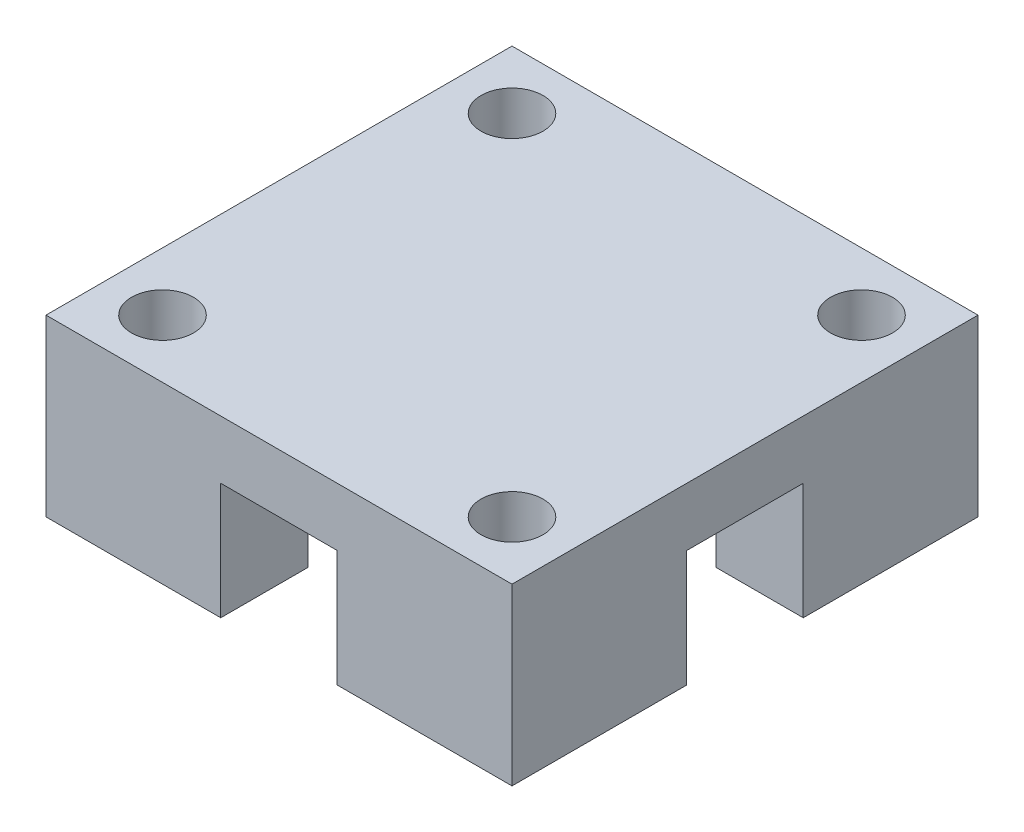
ISO-10303-21;
HEADER;
FILE_DESCRIPTION(('STEP AP214'),'2;1');
FILE_NAME('part.step','',(''),(''),'','','');
FILE_SCHEMA(('AUTOMOTIVE_DESIGN { 1 0 10303 214 1 1 1 1 }'));
ENDSEC;
DATA;
#1=APPLICATION_CONTEXT('core data for automotive mechanical design processes');
#2=APPLICATION_PROTOCOL_DEFINITION('international standard','automotive_design',2000,#1);
#3=PRODUCT_CONTEXT('',#1,'mechanical');
#4=PRODUCT('Part','Part','',(#3));
#5=PRODUCT_RELATED_PRODUCT_CATEGORY('part','',(#4));
#6=PRODUCT_DEFINITION_FORMATION('','',#4);
#7=PRODUCT_DEFINITION_CONTEXT('part definition',#1,'design');
#8=PRODUCT_DEFINITION('design','',#6,#7);
#9=PRODUCT_DEFINITION_SHAPE('','',#8);
#10=(LENGTH_UNIT() NAMED_UNIT(*) SI_UNIT(.MILLI.,.METRE.));
#11=(NAMED_UNIT(*) PLANE_ANGLE_UNIT() SI_UNIT($,.RADIAN.));
#12=(NAMED_UNIT(*) SI_UNIT($,.STERADIAN.) SOLID_ANGLE_UNIT());
#13=UNCERTAINTY_MEASURE_WITH_UNIT(LENGTH_MEASURE(1.E-05),#10,'distance_accuracy_value','');
#14=(GEOMETRIC_REPRESENTATION_CONTEXT(3) GLOBAL_UNCERTAINTY_ASSIGNED_CONTEXT((#13)) GLOBAL_UNIT_ASSIGNED_CONTEXT((#10,
#11,#12)) REPRESENTATION_CONTEXT('',''));
#15=CARTESIAN_POINT('',(0.,0.,0.));
#16=DIRECTION('',(0.,0.,1.));
#17=DIRECTION('',(1.,0.,0.));
#18=AXIS2_PLACEMENT_3D('',#15,#16,#17);
#19=CARTESIAN_POINT('',(-25.4,19.05,-25.4));
#20=DIRECTION('',(0.,0.,1.));
#21=DIRECTION('',(1.,0.,0.));
#22=AXIS2_PLACEMENT_3D('',#19,#20,#21);
#23=PLANE('',#22);
#24=DIRECTION('',(0.,-1.,0.));
#25=VECTOR('',#24,1.);
#26=CARTESIAN_POINT('',(6.35,12.7,-25.4));
#27=LINE('',#26,#25);
#28=CARTESIAN_POINT('',(6.35,12.7,-25.4));
#29=VERTEX_POINT('',#28);
#30=CARTESIAN_POINT('',(6.35,0.,-25.4));
#31=VERTEX_POINT('',#30);
#32=EDGE_CURVE('E357',#29,#31,#27,.T.);
#33=ORIENTED_EDGE('',*,*,#32,.F.);
#34=DIRECTION('',(1.,0.,0.));
#35=VECTOR('',#34,1.);
#36=CARTESIAN_POINT('',(-6.35,12.7,-25.4));
#37=LINE('',#36,#35);
#38=CARTESIAN_POINT('',(-6.35,12.7,-25.4));
#39=VERTEX_POINT('',#38);
#40=EDGE_CURVE('E338',#39,#29,#37,.T.);
#41=ORIENTED_EDGE('',*,*,#40,.F.);
#42=DIRECTION('',(0.,-1.,0.));
#43=VECTOR('',#42,1.);
#44=CARTESIAN_POINT('',(-6.35,12.7,-25.4));
#45=LINE('',#44,#43);
#46=CARTESIAN_POINT('',(-6.35,0.,-25.4));
#47=VERTEX_POINT('',#46);
#48=EDGE_CURVE('E354',#39,#47,#45,.T.);
#49=ORIENTED_EDGE('',*,*,#48,.T.);
#50=DIRECTION('',(-1.,0.,0.));
#51=VECTOR('',#50,1.);
#52=CARTESIAN_POINT('',(-25.4,0.,-25.4));
#53=LINE('',#52,#51);
#54=CARTESIAN_POINT('',(-25.4,0.,-25.4));
#55=VERTEX_POINT('',#54);
#56=EDGE_CURVE('E440',#47,#55,#53,.T.);
#57=ORIENTED_EDGE('',*,*,#56,.T.);
#58=DIRECTION('',(0.,-1.,0.));
#59=VECTOR('',#58,1.);
#60=CARTESIAN_POINT('',(-25.4,19.05,-25.4));
#61=LINE('',#60,#59);
#62=CARTESIAN_POINT('',(-25.4,19.05,-25.4));
#63=VERTEX_POINT('',#62);
#64=EDGE_CURVE('E114',#63,#55,#61,.T.);
#65=ORIENTED_EDGE('',*,*,#64,.F.);
#66=DIRECTION('',(-1.,0.,0.));
#67=VECTOR('',#66,1.);
#68=CARTESIAN_POINT('',(-25.4,19.05,-25.4));
#69=LINE('',#68,#67);
#70=CARTESIAN_POINT('',(25.4,19.05,-25.4));
#71=VERTEX_POINT('',#70);
#72=EDGE_CURVE('E158',#71,#63,#69,.T.);
#73=ORIENTED_EDGE('',*,*,#72,.F.);
#74=DIRECTION('',(0.,-1.,0.));
#75=VECTOR('',#74,1.);
#76=CARTESIAN_POINT('',(25.4,19.05,-25.4));
#77=LINE('',#76,#75);
#78=CARTESIAN_POINT('',(25.4,0.,-25.4));
#79=VERTEX_POINT('',#78);
#80=EDGE_CURVE('E12',#71,#79,#77,.T.);
#81=ORIENTED_EDGE('',*,*,#80,.T.);
#82=EDGE_CURVE('E441',#79,#31,#53,.T.);
#83=ORIENTED_EDGE('',*,*,#82,.T.);
#84=EDGE_LOOP('',(#33,#41,#49,#57,#65,#73,#81,#83));
#85=FACE_BOUND('',#84,.T.);
#86=ADVANCED_FACE('F106',(#85),#23,.F.);
#87=CARTESIAN_POINT('',(-25.4,19.05,25.4));
#88=DIRECTION('',(0.,0.,-1.));
#89=DIRECTION('',(-1.,0.,0.));
#90=AXIS2_PLACEMENT_3D('',#87,#88,#89);
#91=PLANE('',#90);
#92=DIRECTION('',(0.,-1.,0.));
#93=VECTOR('',#92,1.);
#94=CARTESIAN_POINT('',(6.35,12.7,25.4));
#95=LINE('',#94,#93);
#96=CARTESIAN_POINT('',(6.35,12.7,25.4));
#97=VERTEX_POINT('',#96);
#98=CARTESIAN_POINT('',(6.35,0.,25.4));
#99=VERTEX_POINT('',#98);
#100=EDGE_CURVE('E359',#97,#99,#95,.T.);
#101=ORIENTED_EDGE('',*,*,#100,.T.);
#102=DIRECTION('',(1.,0.,0.));
#103=VECTOR('',#102,1.);
#104=CARTESIAN_POINT('',(-25.4,0.,25.4));
#105=LINE('',#104,#103);
#106=CARTESIAN_POINT('',(25.4,0.,25.4));
#107=VERTEX_POINT('',#106);
#108=EDGE_CURVE('E151',#99,#107,#105,.T.);
#109=ORIENTED_EDGE('',*,*,#108,.T.);
#110=DIRECTION('',(0.,-1.,0.));
#111=VECTOR('',#110,1.);
#112=CARTESIAN_POINT('',(25.4,19.05,25.4));
#113=LINE('',#112,#111);
#114=CARTESIAN_POINT('',(25.4,19.05,25.4));
#115=VERTEX_POINT('',#114);
#116=EDGE_CURVE('E436',#115,#107,#113,.T.);
#117=ORIENTED_EDGE('',*,*,#116,.F.);
#118=DIRECTION('',(1.,0.,0.));
#119=VECTOR('',#118,1.);
#120=CARTESIAN_POINT('',(-25.4,19.05,25.4));
#121=LINE('',#120,#119);
#122=CARTESIAN_POINT('',(-25.4,19.05,25.4));
#123=VERTEX_POINT('',#122);
#124=EDGE_CURVE('E130',#123,#115,#121,.T.);
#125=ORIENTED_EDGE('',*,*,#124,.F.);
#126=DIRECTION('',(0.,-1.,0.));
#127=VECTOR('',#126,1.);
#128=CARTESIAN_POINT('',(-25.4,19.05,25.4));
#129=LINE('',#128,#127);
#130=CARTESIAN_POINT('',(-25.4,0.,25.4));
#131=VERTEX_POINT('',#130);
#132=EDGE_CURVE('E451',#123,#131,#129,.T.);
#133=ORIENTED_EDGE('',*,*,#132,.T.);
#134=CARTESIAN_POINT('',(-6.35,0.,25.4));
#135=VERTEX_POINT('',#134);
#136=EDGE_CURVE('E431',#131,#135,#105,.T.);
#137=ORIENTED_EDGE('',*,*,#136,.T.);
#138=DIRECTION('',(0.,-1.,0.));
#139=VECTOR('',#138,1.);
#140=CARTESIAN_POINT('',(-6.35,12.7,25.4));
#141=LINE('',#140,#139);
#142=CARTESIAN_POINT('',(-6.35,12.7,25.4));
#143=VERTEX_POINT('',#142);
#144=EDGE_CURVE('E345',#143,#135,#141,.T.);
#145=ORIENTED_EDGE('',*,*,#144,.F.);
#146=DIRECTION('',(1.,0.,0.));
#147=VECTOR('',#146,1.);
#148=CARTESIAN_POINT('',(-6.35,12.7,25.4));
#149=LINE('',#148,#147);
#150=EDGE_CURVE('E330',#143,#97,#149,.T.);
#151=ORIENTED_EDGE('',*,*,#150,.T.);
#152=EDGE_LOOP('',(#101,#109,#117,#125,#133,#137,#145,#151));
#153=FACE_BOUND('',#152,.T.);
#154=ADVANCED_FACE('F480',(#153),#91,.F.);
#155=CARTESIAN_POINT('',(0.,0.,0.));
#156=DIRECTION('',(0.,1.,0.));
#157=DIRECTION('',(0.,0.,1.));
#158=AXIS2_PLACEMENT_3D('',#155,#156,#157);
#159=PLANE('',#158);
#160=CARTESIAN_POINT('',(19.05,0.,19.05));
#161=DIRECTION('',(0.,1.,0.));
#162=DIRECTION('',(0.,0.,1.));
#163=AXIS2_PLACEMENT_3D('',#160,#161,#162);
#164=CIRCLE('',#163,3.37819999999999);
#165=CARTESIAN_POINT('',(19.05,0.,22.4282));
#166=VERTEX_POINT('',#165);
#167=EDGE_CURVE('E419',#166,#166,#164,.T.);
#168=ORIENTED_EDGE('',*,*,#167,.T.);
#169=EDGE_LOOP('',(#168));
#170=FACE_BOUND('',#169,.T.);
#171=DIRECTION('',(1.,0.,0.));
#172=VECTOR('',#171,1.);
#173=CARTESIAN_POINT('',(-25.4,0.,6.35));
#174=LINE('',#173,#172);
#175=CARTESIAN_POINT('',(15.875,0.,6.35));
#176=VERTEX_POINT('',#175);
#177=CARTESIAN_POINT('',(25.4,0.,6.35));
#178=VERTEX_POINT('',#177);
#179=EDGE_CURVE('E377',#176,#178,#174,.T.);
#180=ORIENTED_EDGE('',*,*,#179,.T.);
#181=DIRECTION('',(0.,0.,-1.));
#182=VECTOR('',#181,1.);
#183=CARTESIAN_POINT('',(25.4,0.,-25.4));
#184=LINE('',#183,#182);
#185=EDGE_CURVE('E437',#107,#178,#184,.T.);
#186=ORIENTED_EDGE('',*,*,#185,.F.);
#187=ORIENTED_EDGE('',*,*,#108,.F.);
#188=DIRECTION('',(0.,0.,-1.));
#189=VECTOR('',#188,1.);
#190=CARTESIAN_POINT('',(6.35,0.,25.4));
#191=LINE('',#190,#189);
#192=CARTESIAN_POINT('',(6.35,0.,15.875));
#193=VERTEX_POINT('',#192);
#194=EDGE_CURVE('E346',#99,#193,#191,.T.);
#195=ORIENTED_EDGE('',*,*,#194,.T.);
#196=DIRECTION('',(1.,0.,0.));
#197=VECTOR('',#196,1.);
#198=CARTESIAN_POINT('',(-15.875,0.,15.875));
#199=LINE('',#198,#197);
#200=CARTESIAN_POINT('',(15.875,0.,15.875));
#201=VERTEX_POINT('',#200);
#202=EDGE_CURVE('E320',#193,#201,#199,.T.);
#203=ORIENTED_EDGE('',*,*,#202,.T.);
#204=DIRECTION('',(0.,0.,-1.));
#205=VECTOR('',#204,1.);
#206=CARTESIAN_POINT('',(15.875,0.,15.875));
#207=LINE('',#206,#205);
#208=EDGE_CURVE('E317',#201,#176,#207,.T.);
#209=ORIENTED_EDGE('',*,*,#208,.T.);
#210=EDGE_LOOP('',(#180,#186,#187,#195,#203,#209));
#211=FACE_BOUND('',#210,.T.);
#212=ADVANCED_FACE('F497',(#170,#211),#159,.F.);
#213=CARTESIAN_POINT('',(-19.05,0.,19.05));
#214=DIRECTION('',(0.,1.,0.));
#215=DIRECTION('',(0.,0.,1.));
#216=AXIS2_PLACEMENT_3D('',#213,#214,#215);
#217=CIRCLE('',#216,3.37819999999999);
#218=CARTESIAN_POINT('',(-19.05,0.,22.4282));
#219=VERTEX_POINT('',#218);
#220=EDGE_CURVE('E425',#219,#219,#217,.T.);
#221=ORIENTED_EDGE('',*,*,#220,.T.);
#222=EDGE_LOOP('',(#221));
#223=FACE_BOUND('',#222,.T.);
#224=CARTESIAN_POINT('',(-25.4,0.,6.35));
#225=VERTEX_POINT('',#224);
#226=CARTESIAN_POINT('',(-15.875,0.,6.35));
#227=VERTEX_POINT('',#226);
#228=EDGE_CURVE('E364',#225,#227,#174,.T.);
#229=ORIENTED_EDGE('',*,*,#228,.T.);
#230=DIRECTION('',(0.,0.,-1.));
#231=VECTOR('',#230,1.);
#232=CARTESIAN_POINT('',(-15.875,0.,15.875));
#233=LINE('',#232,#231);
#234=CARTESIAN_POINT('',(-15.875,0.,15.875));
#235=VERTEX_POINT('',#234);
#236=EDGE_CURVE('E311',#235,#227,#233,.T.);
#237=ORIENTED_EDGE('',*,*,#236,.F.);
#238=CARTESIAN_POINT('',(-6.35,0.,15.875));
#239=VERTEX_POINT('',#238);
#240=EDGE_CURVE('E288',#235,#239,#199,.T.);
#241=ORIENTED_EDGE('',*,*,#240,.T.);
#242=DIRECTION('',(0.,0.,-1.));
#243=VECTOR('',#242,1.);
#244=CARTESIAN_POINT('',(-6.35,0.,25.4));
#245=LINE('',#244,#243);
#246=EDGE_CURVE('E334',#135,#239,#245,.T.);
#247=ORIENTED_EDGE('',*,*,#246,.F.);
#248=ORIENTED_EDGE('',*,*,#136,.F.);
#249=DIRECTION('',(0.,0.,1.));
#250=VECTOR('',#249,1.);
#251=CARTESIAN_POINT('',(-25.4,0.,-25.4));
#252=LINE('',#251,#250);
#253=EDGE_CURVE('E444',#225,#131,#252,.T.);
#254=ORIENTED_EDGE('',*,*,#253,.F.);
#255=EDGE_LOOP('',(#229,#237,#241,#247,#248,#254));
#256=FACE_BOUND('',#255,.T.);
#257=ADVANCED_FACE('F477',(#223,#256),#159,.F.);
#258=CARTESIAN_POINT('',(19.05,0.,-19.05));
#259=DIRECTION('',(0.,1.,0.));
#260=DIRECTION('',(0.,0.,1.));
#261=AXIS2_PLACEMENT_3D('',#258,#259,#260);
#262=CIRCLE('',#261,3.37819999999999);
#263=CARTESIAN_POINT('',(19.05,0.,-15.6718));
#264=VERTEX_POINT('',#263);
#265=EDGE_CURVE('E413',#264,#264,#262,.T.);
#266=ORIENTED_EDGE('',*,*,#265,.T.);
#267=EDGE_LOOP('',(#266));
#268=FACE_BOUND('',#267,.T.);
#269=CARTESIAN_POINT('',(25.4,0.,-6.35));
#270=VERTEX_POINT('',#269);
#271=EDGE_CURVE('E428',#270,#79,#184,.T.);
#272=ORIENTED_EDGE('',*,*,#271,.F.);
#273=DIRECTION('',(1.,0.,0.));
#274=VECTOR('',#273,1.);
#275=CARTESIAN_POINT('',(-25.4,0.,-6.35));
#276=LINE('',#275,#274);
#277=CARTESIAN_POINT('',(15.875,0.,-6.35));
#278=VERTEX_POINT('',#277);
#279=EDGE_CURVE('E378',#278,#270,#276,.T.);
#280=ORIENTED_EDGE('',*,*,#279,.F.);
#281=CARTESIAN_POINT('',(15.875,0.,-15.875));
#282=VERTEX_POINT('',#281);
#283=EDGE_CURVE('E316',#278,#282,#207,.T.);
#284=ORIENTED_EDGE('',*,*,#283,.T.);
#285=DIRECTION('',(1.,0.,0.));
#286=VECTOR('',#285,1.);
#287=CARTESIAN_POINT('',(-15.875,0.,-15.875));
#288=LINE('',#287,#286);
#289=CARTESIAN_POINT('',(6.35,0.,-15.875));
#290=VERTEX_POINT('',#289);
#291=EDGE_CURVE('E314',#290,#282,#288,.T.);
#292=ORIENTED_EDGE('',*,*,#291,.F.);
#293=EDGE_CURVE('E350',#290,#31,#191,.T.);
#294=ORIENTED_EDGE('',*,*,#293,.T.);
#295=ORIENTED_EDGE('',*,*,#82,.F.);
#296=EDGE_LOOP('',(#272,#280,#284,#292,#294,#295));
#297=FACE_BOUND('',#296,.T.);
#298=ADVANCED_FACE('F498',(#268,#297),#159,.F.);
#299=CARTESIAN_POINT('',(25.4,19.05,-25.4));
#300=DIRECTION('',(-1.,0.,0.));
#301=DIRECTION('',(0.,0.,1.));
#302=AXIS2_PLACEMENT_3D('',#299,#300,#301);
#303=PLANE('',#302);
#304=DIRECTION('',(0.,0.,-1.));
#305=VECTOR('',#304,1.);
#306=CARTESIAN_POINT('',(25.4,12.7,6.35));
#307=LINE('',#306,#305);
#308=CARTESIAN_POINT('',(25.4,12.7,6.35));
#309=VERTEX_POINT('',#308);
#310=CARTESIAN_POINT('',(25.4,12.7,-6.35));
#311=VERTEX_POINT('',#310);
#312=EDGE_CURVE('E366',#309,#311,#307,.T.);
#313=ORIENTED_EDGE('',*,*,#312,.T.);
#314=DIRECTION('',(0.,-1.,0.));
#315=VECTOR('',#314,1.);
#316=CARTESIAN_POINT('',(25.4,12.7,-6.35));
#317=LINE('',#316,#315);
#318=EDGE_CURVE('E386',#311,#270,#317,.T.);
#319=ORIENTED_EDGE('',*,*,#318,.T.);
#320=ORIENTED_EDGE('',*,*,#271,.T.);
#321=ORIENTED_EDGE('',*,*,#80,.F.);
#322=DIRECTION('',(0.,0.,-1.));
#323=VECTOR('',#322,1.);
#324=CARTESIAN_POINT('',(25.4,19.05,-25.4));
#325=LINE('',#324,#323);
#326=EDGE_CURVE('E429',#115,#71,#325,.T.);
#327=ORIENTED_EDGE('',*,*,#326,.F.);
#328=ORIENTED_EDGE('',*,*,#116,.T.);
#329=ORIENTED_EDGE('',*,*,#185,.T.);
#330=DIRECTION('',(0.,-1.,0.));
#331=VECTOR('',#330,1.);
#332=CARTESIAN_POINT('',(25.4,12.7,6.35));
#333=LINE('',#332,#331);
#334=EDGE_CURVE('E384',#309,#178,#333,.T.);
#335=ORIENTED_EDGE('',*,*,#334,.F.);
#336=EDGE_LOOP('',(#313,#319,#320,#321,#327,#328,#329,#335));
#337=FACE_BOUND('',#336,.T.);
#338=ADVANCED_FACE('F108',(#337),#303,.F.);
#339=CARTESIAN_POINT('',(-25.4,19.05,-25.4));
#340=DIRECTION('',(1.,0.,0.));
#341=DIRECTION('',(0.,0.,-1.));
#342=AXIS2_PLACEMENT_3D('',#339,#340,#341);
#343=PLANE('',#342);
#344=CARTESIAN_POINT('',(-25.4,0.,-6.35));
#345=VERTEX_POINT('',#344);
#346=EDGE_CURVE('E445',#55,#345,#252,.T.);
#347=ORIENTED_EDGE('',*,*,#346,.T.);
#348=DIRECTION('',(0.,-1.,0.));
#349=VECTOR('',#348,1.);
#350=CARTESIAN_POINT('',(-25.4,12.7,-6.35));
#351=LINE('',#350,#349);
#352=CARTESIAN_POINT('',(-25.4,12.7,-6.35));
#353=VERTEX_POINT('',#352);
#354=EDGE_CURVE('E373',#353,#345,#351,.T.);
#355=ORIENTED_EDGE('',*,*,#354,.F.);
#356=DIRECTION('',(0.,0.,-1.));
#357=VECTOR('',#356,1.);
#358=CARTESIAN_POINT('',(-25.4,12.7,6.35));
#359=LINE('',#358,#357);
#360=CARTESIAN_POINT('',(-25.4,12.7,6.35));
#361=VERTEX_POINT('',#360);
#362=EDGE_CURVE('E361',#361,#353,#359,.T.);
#363=ORIENTED_EDGE('',*,*,#362,.F.);
#364=DIRECTION('',(0.,-1.,0.));
#365=VECTOR('',#364,1.);
#366=CARTESIAN_POINT('',(-25.4,12.7,6.35));
#367=LINE('',#366,#365);
#368=EDGE_CURVE('E381',#361,#225,#367,.T.);
#369=ORIENTED_EDGE('',*,*,#368,.T.);
#370=ORIENTED_EDGE('',*,*,#253,.T.);
#371=ORIENTED_EDGE('',*,*,#132,.F.);
#372=DIRECTION('',(0.,0.,1.));
#373=VECTOR('',#372,1.);
#374=CARTESIAN_POINT('',(-25.4,19.05,-25.4));
#375=LINE('',#374,#373);
#376=EDGE_CURVE('E433',#63,#123,#375,.T.);
#377=ORIENTED_EDGE('',*,*,#376,.F.);
#378=ORIENTED_EDGE('',*,*,#64,.T.);
#379=EDGE_LOOP('',(#347,#355,#363,#369,#370,#371,#377,#378));
#380=FACE_BOUND('',#379,.T.);
#381=ADVANCED_FACE('F457',(#380),#343,.F.);
#382=CARTESIAN_POINT('',(0.,19.05,0.));
#383=DIRECTION('',(0.,1.,0.));
#384=DIRECTION('',(0.,0.,1.));
#385=AXIS2_PLACEMENT_3D('',#382,#383,#384);
#386=PLANE('',#385);
#387=CARTESIAN_POINT('',(-19.05,19.05,-19.05));
#388=DIRECTION('',(0.,1.,0.));
#389=DIRECTION('',(0.,0.,1.));
#390=AXIS2_PLACEMENT_3D('',#387,#388,#389);
#391=CIRCLE('',#390,3.37819999999999);
#392=CARTESIAN_POINT('',(-19.05,19.05,-15.6718));
#393=VERTEX_POINT('',#392);
#394=EDGE_CURVE('E400',#393,#393,#391,.T.);
#395=ORIENTED_EDGE('',*,*,#394,.F.);
#396=EDGE_LOOP('',(#395));
#397=FACE_BOUND('',#396,.T.);
#398=CARTESIAN_POINT('',(19.05,19.05,-19.05));
#399=DIRECTION('',(0.,1.,0.));
#400=DIRECTION('',(0.,0.,1.));
#401=AXIS2_PLACEMENT_3D('',#398,#399,#400);
#402=CIRCLE('',#401,3.37819999999999);
#403=CARTESIAN_POINT('',(19.05,19.05,-15.6718));
#404=VERTEX_POINT('',#403);
#405=EDGE_CURVE('E410',#404,#404,#402,.T.);
#406=ORIENTED_EDGE('',*,*,#405,.F.);
#407=EDGE_LOOP('',(#406));
#408=FACE_BOUND('',#407,.T.);
#409=CARTESIAN_POINT('',(19.05,19.05,19.05));
#410=DIRECTION('',(0.,1.,0.));
#411=DIRECTION('',(0.,0.,1.));
#412=AXIS2_PLACEMENT_3D('',#409,#410,#411);
#413=CIRCLE('',#412,3.37819999999999);
#414=CARTESIAN_POINT('',(19.05,19.05,22.4282));
#415=VERTEX_POINT('',#414);
#416=EDGE_CURVE('E416',#415,#415,#413,.T.);
#417=ORIENTED_EDGE('',*,*,#416,.F.);
#418=EDGE_LOOP('',(#417));
#419=FACE_BOUND('',#418,.T.);
#420=CARTESIAN_POINT('',(-19.05,19.05,19.05));
#421=DIRECTION('',(0.,1.,0.));
#422=DIRECTION('',(0.,0.,1.));
#423=AXIS2_PLACEMENT_3D('',#420,#421,#422);
#424=CIRCLE('',#423,3.37819999999999);
#425=CARTESIAN_POINT('',(-19.05,19.05,22.4282));
#426=VERTEX_POINT('',#425);
#427=EDGE_CURVE('E422',#426,#426,#424,.T.);
#428=ORIENTED_EDGE('',*,*,#427,.F.);
#429=EDGE_LOOP('',(#428));
#430=FACE_BOUND('',#429,.T.);
#431=ORIENTED_EDGE('',*,*,#326,.T.);
#432=ORIENTED_EDGE('',*,*,#72,.T.);
#433=ORIENTED_EDGE('',*,*,#376,.T.);
#434=ORIENTED_EDGE('',*,*,#124,.T.);
#435=EDGE_LOOP('',(#431,#432,#433,#434));
#436=FACE_BOUND('',#435,.T.);
#437=ADVANCED_FACE('F486',(#397,#408,#419,#430,#436),#386,.T.);
#438=CARTESIAN_POINT('',(-19.05,0.,-19.05));
#439=DIRECTION('',(0.,1.,0.));
#440=DIRECTION('',(0.,0.,1.));
#441=AXIS2_PLACEMENT_3D('',#438,#439,#440);
#442=CIRCLE('',#441,3.37819999999999);
#443=CARTESIAN_POINT('',(-19.05,0.,-15.6718));
#444=VERTEX_POINT('',#443);
#445=EDGE_CURVE('E407',#444,#444,#442,.T.);
#446=ORIENTED_EDGE('',*,*,#445,.T.);
#447=EDGE_LOOP('',(#446));
#448=FACE_BOUND('',#447,.T.);
#449=CARTESIAN_POINT('',(-15.875,0.,-6.35));
#450=VERTEX_POINT('',#449);
#451=CARTESIAN_POINT('',(-15.875,0.,-15.875));
#452=VERTEX_POINT('',#451);
#453=EDGE_CURVE('E293',#450,#452,#233,.T.);
#454=ORIENTED_EDGE('',*,*,#453,.F.);
#455=EDGE_CURVE('E374',#345,#450,#276,.T.);
#456=ORIENTED_EDGE('',*,*,#455,.F.);
#457=ORIENTED_EDGE('',*,*,#346,.F.);
#458=ORIENTED_EDGE('',*,*,#56,.F.);
#459=CARTESIAN_POINT('',(-6.35,0.,-15.875));
#460=VERTEX_POINT('',#459);
#461=EDGE_CURVE('E349',#460,#47,#245,.T.);
#462=ORIENTED_EDGE('',*,*,#461,.F.);
#463=EDGE_CURVE('E121',#452,#460,#288,.T.);
#464=ORIENTED_EDGE('',*,*,#463,.F.);
#465=EDGE_LOOP('',(#454,#456,#457,#458,#462,#464));
#466=FACE_BOUND('',#465,.T.);
#467=ADVANCED_FACE('F463',(#448,#466),#159,.F.);
#468=CARTESIAN_POINT('',(-19.05,19.05,19.05));
#469=DIRECTION('',(0.,1.,0.));
#470=DIRECTION('',(0.,0.,1.));
#471=AXIS2_PLACEMENT_3D('',#468,#469,#470);
#472=CYLINDRICAL_SURFACE('',#471,3.37819999999999);
#473=ORIENTED_EDGE('',*,*,#220,.F.);
#474=EDGE_LOOP('',(#473));
#475=FACE_BOUND('',#474,.T.);
#476=ORIENTED_EDGE('',*,*,#427,.T.);
#477=EDGE_LOOP('',(#476));
#478=FACE_BOUND('',#477,.T.);
#479=ADVANCED_FACE('F494',(#475,#478),#472,.F.);
#480=CARTESIAN_POINT('',(19.05,19.05,19.05));
#481=DIRECTION('',(0.,1.,0.));
#482=DIRECTION('',(0.,0.,1.));
#483=AXIS2_PLACEMENT_3D('',#480,#481,#482);
#484=CYLINDRICAL_SURFACE('',#483,3.37819999999999);
#485=ORIENTED_EDGE('',*,*,#167,.F.);
#486=EDGE_LOOP('',(#485));
#487=FACE_BOUND('',#486,.T.);
#488=ORIENTED_EDGE('',*,*,#416,.T.);
#489=EDGE_LOOP('',(#488));
#490=FACE_BOUND('',#489,.T.);
#491=ADVANCED_FACE('F592',(#487,#490),#484,.F.);
#492=CARTESIAN_POINT('',(19.05,19.05,-19.05));
#493=DIRECTION('',(0.,1.,0.));
#494=DIRECTION('',(0.,0.,1.));
#495=AXIS2_PLACEMENT_3D('',#492,#493,#494);
#496=CYLINDRICAL_SURFACE('',#495,3.37819999999999);
#497=ORIENTED_EDGE('',*,*,#265,.F.);
#498=EDGE_LOOP('',(#497));
#499=FACE_BOUND('',#498,.T.);
#500=ORIENTED_EDGE('',*,*,#405,.T.);
#501=EDGE_LOOP('',(#500));
#502=FACE_BOUND('',#501,.T.);
#503=ADVANCED_FACE('F566',(#499,#502),#496,.F.);
#504=CARTESIAN_POINT('',(-19.05,19.05,-19.05));
#505=DIRECTION('',(0.,1.,0.));
#506=DIRECTION('',(0.,0.,1.));
#507=AXIS2_PLACEMENT_3D('',#504,#505,#506);
#508=CYLINDRICAL_SURFACE('',#507,3.37819999999999);
#509=ORIENTED_EDGE('',*,*,#445,.F.);
#510=EDGE_LOOP('',(#509));
#511=FACE_BOUND('',#510,.T.);
#512=ORIENTED_EDGE('',*,*,#394,.T.);
#513=EDGE_LOOP('',(#512));
#514=FACE_BOUND('',#513,.T.);
#515=ADVANCED_FACE('F557',(#511,#514),#508,.F.);
#516=CARTESIAN_POINT('',(-15.875,12.7,15.875));
#517=DIRECTION('',(-1.,0.,0.));
#518=DIRECTION('',(0.,0.,1.));
#519=AXIS2_PLACEMENT_3D('',#516,#517,#518);
#520=PLANE('',#519);
#521=DIRECTION('',(0.,0.,-1.));
#522=VECTOR('',#521,1.);
#523=CARTESIAN_POINT('',(-15.875,12.7,15.875));
#524=LINE('',#523,#522);
#525=CARTESIAN_POINT('',(-15.875,12.7,15.875));
#526=VERTEX_POINT('',#525);
#527=CARTESIAN_POINT('',(-15.875,12.7,6.35));
#528=VERTEX_POINT('',#527);
#529=EDGE_CURVE('E287',#526,#528,#524,.T.);
#530=ORIENTED_EDGE('',*,*,#529,.F.);
#531=DIRECTION('',(0.,-1.,0.));
#532=VECTOR('',#531,1.);
#533=CARTESIAN_POINT('',(-15.875,12.7,15.875));
#534=LINE('',#533,#532);
#535=EDGE_CURVE('E323',#526,#235,#534,.T.);
#536=ORIENTED_EDGE('',*,*,#535,.T.);
#537=ORIENTED_EDGE('',*,*,#236,.T.);
#538=DIRECTION('',(0.,-1.,0.));
#539=VECTOR('',#538,1.);
#540=CARTESIAN_POINT('',(-15.875,12.7,6.35));
#541=LINE('',#540,#539);
#542=EDGE_CURVE('E397',#528,#227,#541,.T.);
#543=ORIENTED_EDGE('',*,*,#542,.F.);
#544=EDGE_LOOP('',(#530,#536,#537,#543));
#545=FACE_BOUND('',#544,.T.);
#546=ADVANCED_FACE('F555',(#545),#520,.F.);
#547=CARTESIAN_POINT('',(-15.875,12.7,15.875));
#548=DIRECTION('',(0.,0.,-1.));
#549=DIRECTION('',(-1.,0.,0.));
#550=AXIS2_PLACEMENT_3D('',#547,#548,#549);
#551=PLANE('',#550);
#552=ORIENTED_EDGE('',*,*,#240,.F.);
#553=ORIENTED_EDGE('',*,*,#535,.F.);
#554=DIRECTION('',(1.,0.,0.));
#555=VECTOR('',#554,1.);
#556=CARTESIAN_POINT('',(-15.875,12.7,15.875));
#557=LINE('',#556,#555);
#558=CARTESIAN_POINT('',(-6.35,12.7,15.875));
#559=VERTEX_POINT('',#558);
#560=EDGE_CURVE('E295',#526,#559,#557,.T.);
#561=ORIENTED_EDGE('',*,*,#560,.T.);
#562=DIRECTION('',(0.,1.,0.));
#563=VECTOR('',#562,1.);
#564=CARTESIAN_POINT('',(-6.35,12.7,15.875));
#565=LINE('',#564,#563);
#566=EDGE_CURVE('E398',#239,#559,#565,.T.);
#567=ORIENTED_EDGE('',*,*,#566,.F.);
#568=EDGE_LOOP('',(#552,#553,#561,#567));
#569=FACE_BOUND('',#568,.T.);
#570=ADVANCED_FACE('F553',(#569),#551,.T.);
#571=CARTESIAN_POINT('',(15.875,12.7,15.875));
#572=DIRECTION('',(-1.,0.,0.));
#573=DIRECTION('',(0.,0.,1.));
#574=AXIS2_PLACEMENT_3D('',#571,#572,#573);
#575=PLANE('',#574);
#576=DIRECTION('',(0.,-1.,0.));
#577=VECTOR('',#576,1.);
#578=CARTESIAN_POINT('',(15.875,12.7,6.35));
#579=LINE('',#578,#577);
#580=CARTESIAN_POINT('',(15.875,12.7,6.35));
#581=VERTEX_POINT('',#580);
#582=EDGE_CURVE('E392',#581,#176,#579,.T.);
#583=ORIENTED_EDGE('',*,*,#582,.T.);
#584=ORIENTED_EDGE('',*,*,#208,.F.);
#585=DIRECTION('',(0.,-1.,0.));
#586=VECTOR('',#585,1.);
#587=CARTESIAN_POINT('',(15.875,12.7,15.875));
#588=LINE('',#587,#586);
#589=CARTESIAN_POINT('',(15.875,12.7,15.875));
#590=VERTEX_POINT('',#589);
#591=EDGE_CURVE('E326',#590,#201,#588,.T.);
#592=ORIENTED_EDGE('',*,*,#591,.F.);
#593=DIRECTION('',(0.,0.,-1.));
#594=VECTOR('',#593,1.);
#595=CARTESIAN_POINT('',(15.875,12.7,15.875));
#596=LINE('',#595,#594);
#597=EDGE_CURVE('E304',#590,#581,#596,.T.);
#598=ORIENTED_EDGE('',*,*,#597,.T.);
#599=EDGE_LOOP('',(#583,#584,#592,#598));
#600=FACE_BOUND('',#599,.T.);
#601=ADVANCED_FACE('F563',(#600),#575,.T.);
#602=DIRECTION('',(0.,1.,0.));
#603=VECTOR('',#602,1.);
#604=CARTESIAN_POINT('',(6.35,12.7,15.875));
#605=LINE('',#604,#603);
#606=CARTESIAN_POINT('',(6.35,12.7,15.875));
#607=VERTEX_POINT('',#606);
#608=EDGE_CURVE('E394',#193,#607,#605,.T.);
#609=ORIENTED_EDGE('',*,*,#608,.T.);
#610=EDGE_CURVE('E308',#607,#590,#557,.T.);
#611=ORIENTED_EDGE('',*,*,#610,.T.);
#612=ORIENTED_EDGE('',*,*,#591,.T.);
#613=ORIENTED_EDGE('',*,*,#202,.F.);
#614=EDGE_LOOP('',(#609,#611,#612,#613));
#615=FACE_BOUND('',#614,.T.);
#616=ADVANCED_FACE('F565',(#615),#551,.T.);
#617=CARTESIAN_POINT('',(15.875,12.7,-6.35));
#618=VERTEX_POINT('',#617);
#619=CARTESIAN_POINT('',(15.875,12.7,-15.875));
#620=VERTEX_POINT('',#619);
#621=EDGE_CURVE('E300',#618,#620,#596,.T.);
#622=ORIENTED_EDGE('',*,*,#621,.T.);
#623=DIRECTION('',(0.,-1.,0.));
#624=VECTOR('',#623,1.);
#625=CARTESIAN_POINT('',(15.875,12.7,-15.875));
#626=LINE('',#625,#624);
#627=EDGE_CURVE('E294',#620,#282,#626,.T.);
#628=ORIENTED_EDGE('',*,*,#627,.T.);
#629=ORIENTED_EDGE('',*,*,#283,.F.);
#630=DIRECTION('',(0.,-1.,0.));
#631=VECTOR('',#630,1.);
#632=CARTESIAN_POINT('',(15.875,12.7,-6.35));
#633=LINE('',#632,#631);
#634=EDGE_CURVE('E390',#618,#278,#633,.T.);
#635=ORIENTED_EDGE('',*,*,#634,.F.);
#636=EDGE_LOOP('',(#622,#628,#629,#635));
#637=FACE_BOUND('',#636,.T.);
#638=ADVANCED_FACE('F527',(#637),#575,.T.);
#639=CARTESIAN_POINT('',(-15.875,12.7,-15.875));
#640=DIRECTION('',(0.,0.,-1.));
#641=DIRECTION('',(-1.,0.,0.));
#642=AXIS2_PLACEMENT_3D('',#639,#640,#641);
#643=PLANE('',#642);
#644=ORIENTED_EDGE('',*,*,#291,.T.);
#645=ORIENTED_EDGE('',*,*,#627,.F.);
#646=DIRECTION('',(1.,0.,0.));
#647=VECTOR('',#646,1.);
#648=CARTESIAN_POINT('',(-15.875,12.7,-15.875));
#649=LINE('',#648,#647);
#650=CARTESIAN_POINT('',(6.35,12.7,-15.875));
#651=VERTEX_POINT('',#650);
#652=EDGE_CURVE('E301',#651,#620,#649,.T.);
#653=ORIENTED_EDGE('',*,*,#652,.F.);
#654=DIRECTION('',(0.,1.,0.));
#655=VECTOR('',#654,1.);
#656=CARTESIAN_POINT('',(6.35,12.7,-15.875));
#657=LINE('',#656,#655);
#658=EDGE_CURVE('E325',#290,#651,#657,.T.);
#659=ORIENTED_EDGE('',*,*,#658,.F.);
#660=EDGE_LOOP('',(#644,#645,#653,#659));
#661=FACE_BOUND('',#660,.T.);
#662=ADVANCED_FACE('F524',(#661),#643,.F.);
#663=CARTESIAN_POINT('',(-25.4,12.7,-6.35));
#664=DIRECTION('',(0.,0.,-1.));
#665=DIRECTION('',(-1.,0.,0.));
#666=AXIS2_PLACEMENT_3D('',#663,#664,#665);
#667=PLANE('',#666);
#668=ORIENTED_EDGE('',*,*,#634,.T.);
#669=ORIENTED_EDGE('',*,*,#279,.T.);
#670=ORIENTED_EDGE('',*,*,#318,.F.);
#671=DIRECTION('',(1.,0.,0.));
#672=VECTOR('',#671,1.);
#673=CARTESIAN_POINT('',(-25.4,12.7,-6.35));
#674=LINE('',#673,#672);
#675=EDGE_CURVE('E363',#618,#311,#674,.T.);
#676=ORIENTED_EDGE('',*,*,#675,.F.);
#677=EDGE_LOOP('',(#668,#669,#670,#676));
#678=FACE_BOUND('',#677,.T.);
#679=ADVANCED_FACE('F572',(#678),#667,.F.);
#680=CARTESIAN_POINT('',(-25.4,12.7,6.35));
#681=DIRECTION('',(0.,0.,-1.));
#682=DIRECTION('',(-1.,0.,0.));
#683=AXIS2_PLACEMENT_3D('',#680,#681,#682);
#684=PLANE('',#683);
#685=DIRECTION('',(1.,0.,0.));
#686=VECTOR('',#685,1.);
#687=CARTESIAN_POINT('',(-25.4,12.7,6.35));
#688=LINE('',#687,#686);
#689=EDGE_CURVE('E369',#581,#309,#688,.T.);
#690=ORIENTED_EDGE('',*,*,#689,.T.);
#691=ORIENTED_EDGE('',*,*,#334,.T.);
#692=ORIENTED_EDGE('',*,*,#179,.F.);
#693=ORIENTED_EDGE('',*,*,#582,.F.);
#694=EDGE_LOOP('',(#690,#691,#692,#693));
#695=FACE_BOUND('',#694,.T.);
#696=ADVANCED_FACE('F558',(#695),#684,.T.);
#697=DIRECTION('',(0.,1.,0.));
#698=VECTOR('',#697,1.);
#699=CARTESIAN_POINT('',(-6.35,12.7,-15.875));
#700=LINE('',#699,#698);
#701=CARTESIAN_POINT('',(-6.35,12.7,-15.875));
#702=VERTEX_POINT('',#701);
#703=EDGE_CURVE('E298',#460,#702,#700,.T.);
#704=ORIENTED_EDGE('',*,*,#703,.T.);
#705=CARTESIAN_POINT('',(-15.875,12.7,-15.875));
#706=VERTEX_POINT('',#705);
#707=EDGE_CURVE('E283',#706,#702,#649,.T.);
#708=ORIENTED_EDGE('',*,*,#707,.F.);
#709=DIRECTION('',(0.,-1.,0.));
#710=VECTOR('',#709,1.);
#711=CARTESIAN_POINT('',(-15.875,12.7,-15.875));
#712=LINE('',#711,#710);
#713=EDGE_CURVE('E290',#706,#452,#712,.T.);
#714=ORIENTED_EDGE('',*,*,#713,.T.);
#715=ORIENTED_EDGE('',*,*,#463,.T.);
#716=EDGE_LOOP('',(#704,#708,#714,#715));
#717=FACE_BOUND('',#716,.T.);
#718=ADVANCED_FACE('F297',(#717),#643,.F.);
#719=DIRECTION('',(0.,-1.,0.));
#720=VECTOR('',#719,1.);
#721=CARTESIAN_POINT('',(-15.875,12.7,-6.35));
#722=LINE('',#721,#720);
#723=CARTESIAN_POINT('',(-15.875,12.7,-6.35));
#724=VERTEX_POINT('',#723);
#725=EDGE_CURVE('E395',#724,#450,#722,.T.);
#726=ORIENTED_EDGE('',*,*,#725,.T.);
#727=ORIENTED_EDGE('',*,*,#453,.T.);
#728=ORIENTED_EDGE('',*,*,#713,.F.);
#729=EDGE_CURVE('E278',#724,#706,#524,.T.);
#730=ORIENTED_EDGE('',*,*,#729,.F.);
#731=EDGE_LOOP('',(#726,#727,#728,#730));
#732=FACE_BOUND('',#731,.T.);
#733=ADVANCED_FACE('F291',(#732),#520,.F.);
#734=CARTESIAN_POINT('',(0.,12.7,0.));
#735=DIRECTION('',(0.,-1.,0.));
#736=DIRECTION('',(0.,0.,-1.));
#737=AXIS2_PLACEMENT_3D('',#734,#735,#736);
#738=PLANE('',#737);
#739=ORIENTED_EDGE('',*,*,#597,.F.);
#740=ORIENTED_EDGE('',*,*,#610,.F.);
#741=DIRECTION('',(0.,0.,-1.));
#742=VECTOR('',#741,1.);
#743=CARTESIAN_POINT('',(6.35,12.7,25.4));
#744=LINE('',#743,#742);
#745=EDGE_CURVE('E335',#97,#607,#744,.T.);
#746=ORIENTED_EDGE('',*,*,#745,.F.);
#747=ORIENTED_EDGE('',*,*,#150,.F.);
#748=DIRECTION('',(0.,0.,-1.));
#749=VECTOR('',#748,1.);
#750=CARTESIAN_POINT('',(-6.35,12.7,25.4));
#751=LINE('',#750,#749);
#752=EDGE_CURVE('E342',#143,#559,#751,.T.);
#753=ORIENTED_EDGE('',*,*,#752,.T.);
#754=ORIENTED_EDGE('',*,*,#560,.F.);
#755=ORIENTED_EDGE('',*,*,#529,.T.);
#756=EDGE_CURVE('E370',#361,#528,#688,.T.);
#757=ORIENTED_EDGE('',*,*,#756,.F.);
#758=ORIENTED_EDGE('',*,*,#362,.T.);
#759=EDGE_CURVE('E285',#353,#724,#674,.T.);
#760=ORIENTED_EDGE('',*,*,#759,.T.);
#761=ORIENTED_EDGE('',*,*,#729,.T.);
#762=ORIENTED_EDGE('',*,*,#707,.T.);
#763=EDGE_CURVE('E341',#702,#39,#751,.T.);
#764=ORIENTED_EDGE('',*,*,#763,.T.);
#765=ORIENTED_EDGE('',*,*,#40,.T.);
#766=EDGE_CURVE('E333',#651,#29,#744,.T.);
#767=ORIENTED_EDGE('',*,*,#766,.F.);
#768=ORIENTED_EDGE('',*,*,#652,.T.);
#769=ORIENTED_EDGE('',*,*,#621,.F.);
#770=ORIENTED_EDGE('',*,*,#675,.T.);
#771=ORIENTED_EDGE('',*,*,#312,.F.);
#772=ORIENTED_EDGE('',*,*,#689,.F.);
#773=EDGE_LOOP('',(#739,#740,#746,#747,#753,#754,#755,#757,#758,#760,#761,#762,#764,#765,#767,
#768,#769,#770,#771,#772));
#774=FACE_BOUND('',#773,.T.);
#775=ADVANCED_FACE('F281',(#774),#738,.T.);
#776=ORIENTED_EDGE('',*,*,#759,.F.);
#777=ORIENTED_EDGE('',*,*,#354,.T.);
#778=ORIENTED_EDGE('',*,*,#455,.T.);
#779=ORIENTED_EDGE('',*,*,#725,.F.);
#780=EDGE_LOOP('',(#776,#777,#778,#779));
#781=FACE_BOUND('',#780,.T.);
#782=ADVANCED_FACE('F466',(#781),#667,.F.);
#783=ORIENTED_EDGE('',*,*,#542,.T.);
#784=ORIENTED_EDGE('',*,*,#228,.F.);
#785=ORIENTED_EDGE('',*,*,#368,.F.);
#786=ORIENTED_EDGE('',*,*,#756,.T.);
#787=EDGE_LOOP('',(#783,#784,#785,#786));
#788=FACE_BOUND('',#787,.T.);
#789=ADVANCED_FACE('F474',(#788),#684,.T.);
#790=CARTESIAN_POINT('',(6.35,12.7,25.4));
#791=DIRECTION('',(-1.,0.,0.));
#792=DIRECTION('',(0.,0.,1.));
#793=AXIS2_PLACEMENT_3D('',#790,#791,#792);
#794=PLANE('',#793);
#795=ORIENTED_EDGE('',*,*,#194,.F.);
#796=ORIENTED_EDGE('',*,*,#100,.F.);
#797=ORIENTED_EDGE('',*,*,#745,.T.);
#798=ORIENTED_EDGE('',*,*,#608,.F.);
#799=EDGE_LOOP('',(#795,#796,#797,#798));
#800=FACE_BOUND('',#799,.T.);
#801=ADVANCED_FACE('F542',(#800),#794,.T.);
#802=CARTESIAN_POINT('',(-6.35,12.7,25.4));
#803=DIRECTION('',(-1.,0.,0.));
#804=DIRECTION('',(0.,0.,1.));
#805=AXIS2_PLACEMENT_3D('',#802,#803,#804);
#806=PLANE('',#805);
#807=ORIENTED_EDGE('',*,*,#566,.T.);
#808=ORIENTED_EDGE('',*,*,#752,.F.);
#809=ORIENTED_EDGE('',*,*,#144,.T.);
#810=ORIENTED_EDGE('',*,*,#246,.T.);
#811=EDGE_LOOP('',(#807,#808,#809,#810));
#812=FACE_BOUND('',#811,.T.);
#813=ADVANCED_FACE('F537',(#812),#806,.F.);
#814=ORIENTED_EDGE('',*,*,#658,.T.);
#815=ORIENTED_EDGE('',*,*,#766,.T.);
#816=ORIENTED_EDGE('',*,*,#32,.T.);
#817=ORIENTED_EDGE('',*,*,#293,.F.);
#818=EDGE_LOOP('',(#814,#815,#816,#817));
#819=FACE_BOUND('',#818,.T.);
#820=ADVANCED_FACE('F514',(#819),#794,.T.);
#821=ORIENTED_EDGE('',*,*,#461,.T.);
#822=ORIENTED_EDGE('',*,*,#48,.F.);
#823=ORIENTED_EDGE('',*,*,#763,.F.);
#824=ORIENTED_EDGE('',*,*,#703,.F.);
#825=EDGE_LOOP('',(#821,#822,#823,#824));
#826=FACE_BOUND('',#825,.T.);
#827=ADVANCED_FACE('F534',(#826),#806,.F.);
#828=CLOSED_SHELL('',(#86,#154,#212,#257,#298,#338,#381,#437,#467,#479,#491,#503,#515,#546,#570,
#601,#616,#638,#662,#679,#696,#718,#733,#775,#782,#789,#801,#813,#820,#827));
#829=MANIFOLD_SOLID_BREP('B2',#828);
#830=ADVANCED_BREP_SHAPE_REPRESENTATION('',(#18,#829),#14);
#831=SHAPE_DEFINITION_REPRESENTATION(#9,#830);
ENDSEC;
END-ISO-10303-21;
